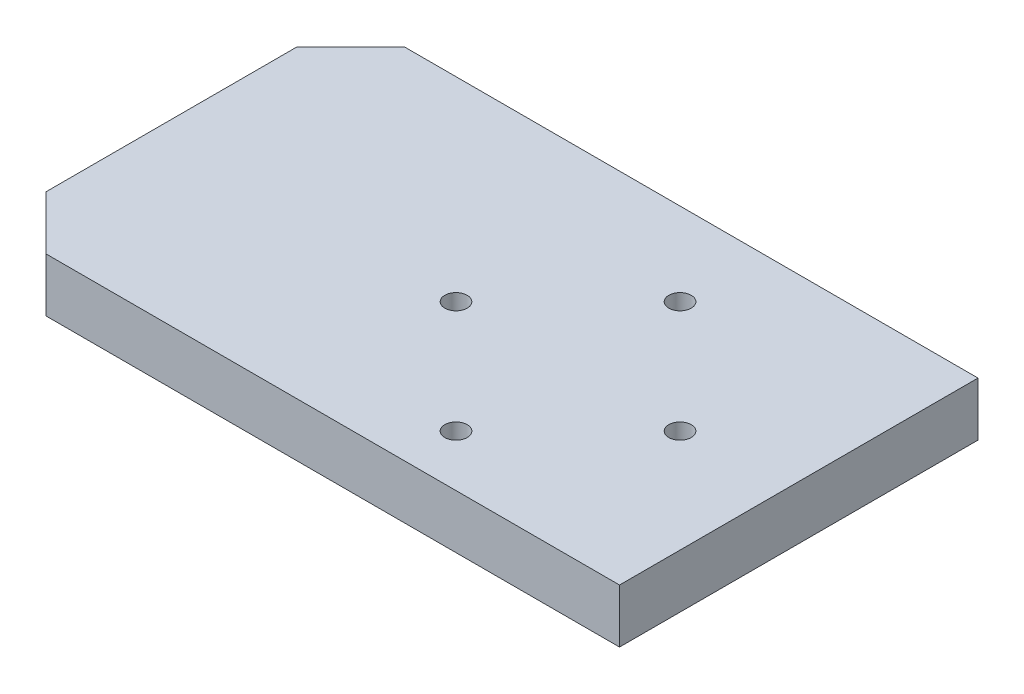
ISO-10303-21;
HEADER;
FILE_DESCRIPTION(('STEP AP214'),'2;1');
FILE_NAME('part.step','',(''),(''),'','','');
FILE_SCHEMA(('AUTOMOTIVE_DESIGN { 1 0 10303 214 1 1 1 1 }'));
ENDSEC;
DATA;
#1=APPLICATION_CONTEXT('core data for automotive mechanical design processes');
#2=APPLICATION_PROTOCOL_DEFINITION('international standard','automotive_design',2000,#1);
#3=PRODUCT_CONTEXT('',#1,'mechanical');
#4=PRODUCT('Part','Part','',(#3));
#5=PRODUCT_RELATED_PRODUCT_CATEGORY('part','',(#4));
#6=PRODUCT_DEFINITION_FORMATION('','',#4);
#7=PRODUCT_DEFINITION_CONTEXT('part definition',#1,'design');
#8=PRODUCT_DEFINITION('design','',#6,#7);
#9=PRODUCT_DEFINITION_SHAPE('','',#8);
#10=(LENGTH_UNIT() NAMED_UNIT(*) SI_UNIT(.MILLI.,.METRE.));
#11=(NAMED_UNIT(*) PLANE_ANGLE_UNIT() SI_UNIT($,.RADIAN.));
#12=(NAMED_UNIT(*) SI_UNIT($,.STERADIAN.) SOLID_ANGLE_UNIT());
#13=UNCERTAINTY_MEASURE_WITH_UNIT(LENGTH_MEASURE(1.E-05),#10,'distance_accuracy_value','');
#14=(GEOMETRIC_REPRESENTATION_CONTEXT(3) GLOBAL_UNCERTAINTY_ASSIGNED_CONTEXT((#13)) GLOBAL_UNIT_ASSIGNED_CONTEXT((#10,
#11,#12)) REPRESENTATION_CONTEXT('',''));
#15=CARTESIAN_POINT('',(0.,0.,0.));
#16=DIRECTION('',(0.,0.,1.));
#17=DIRECTION('',(1.,0.,0.));
#18=AXIS2_PLACEMENT_3D('',#15,#16,#17);
#19=CARTESIAN_POINT('',(0.,12.,0.));
#20=DIRECTION('',(0.,-1.,0.));
#21=DIRECTION('',(0.,0.,-1.));
#22=AXIS2_PLACEMENT_3D('',#19,#20,#21);
#23=PLANE('',#22);
#24=DIRECTION('',(0.,0.,-1.));
#25=VECTOR('',#24,1.);
#26=CARTESIAN_POINT('',(70.,12.,-40.));
#27=LINE('',#26,#25);
#28=CARTESIAN_POINT('',(70.,12.,40.));
#29=VERTEX_POINT('',#28);
#30=CARTESIAN_POINT('',(70.,12.,-40.));
#31=VERTEX_POINT('',#30);
#32=EDGE_CURVE('E129',#29,#31,#27,.T.);
#33=ORIENTED_EDGE('',*,*,#32,.T.);
#34=DIRECTION('',(-1.,0.,0.));
#35=VECTOR('',#34,1.);
#36=CARTESIAN_POINT('',(70.,12.,-40.));
#37=LINE('',#36,#35);
#38=CARTESIAN_POINT('',(-58.,12.,-39.9999999999999));
#39=VERTEX_POINT('',#38);
#40=EDGE_CURVE('E87',#31,#39,#37,.T.);
#41=ORIENTED_EDGE('',*,*,#40,.T.);
#42=DIRECTION('',(-0.70710678118655,0.,0.707106781186545));
#43=VECTOR('',#42,1.);
#44=CARTESIAN_POINT('',(-58.,12.,-39.9999999999999));
#45=LINE('',#44,#43);
#46=CARTESIAN_POINT('',(-70.,12.,-28.));
#47=VERTEX_POINT('',#46);
#48=EDGE_CURVE('E100',#39,#47,#45,.T.);
#49=ORIENTED_EDGE('',*,*,#48,.T.);
#50=DIRECTION('',(0.,0.,1.));
#51=VECTOR('',#50,1.);
#52=CARTESIAN_POINT('',(-70.,12.,-28.));
#53=LINE('',#52,#51);
#54=CARTESIAN_POINT('',(-70.,12.,28.));
#55=VERTEX_POINT('',#54);
#56=EDGE_CURVE('E94',#47,#55,#53,.T.);
#57=ORIENTED_EDGE('',*,*,#56,.T.);
#58=DIRECTION('',(0.707106781186547,0.,0.707106781186548));
#59=VECTOR('',#58,1.);
#60=CARTESIAN_POINT('',(-58.,12.,40.));
#61=LINE('',#60,#59);
#62=CARTESIAN_POINT('',(-58.,12.,40.));
#63=VERTEX_POINT('',#62);
#64=EDGE_CURVE('E98',#55,#63,#61,.T.);
#65=ORIENTED_EDGE('',*,*,#64,.T.);
#66=DIRECTION('',(1.,0.,0.));
#67=VECTOR('',#66,1.);
#68=CARTESIAN_POINT('',(70.,12.,40.));
#69=LINE('',#68,#67);
#70=EDGE_CURVE('E50',#63,#29,#69,.T.);
#71=ORIENTED_EDGE('',*,*,#70,.T.);
#72=EDGE_LOOP('',(#33,#41,#49,#57,#65,#71));
#73=FACE_BOUND('',#72,.T.);
#74=CARTESIAN_POINT('',(22.,12.,-21.5));
#75=DIRECTION('',(0.,1.,0.));
#76=DIRECTION('',(0.,0.,1.));
#77=AXIS2_PLACEMENT_3D('',#74,#75,#76);
#78=CIRCLE('',#77,2.5);
#79=CARTESIAN_POINT('',(22.,12.,-19.));
#80=VERTEX_POINT('',#79);
#81=EDGE_CURVE('E122',#80,#80,#78,.T.);
#82=ORIENTED_EDGE('',*,*,#81,.F.);
#83=EDGE_LOOP('',(#82));
#84=FACE_BOUND('',#83,.T.);
#85=CARTESIAN_POINT('',(47.0000000000008,12.,3.49999999999938));
#86=DIRECTION('',(0.,1.,0.));
#87=DIRECTION('',(0.,0.,1.));
#88=AXIS2_PLACEMENT_3D('',#85,#86,#87);
#89=CIRCLE('',#88,2.5);
#90=CARTESIAN_POINT('',(47.0000000000008,12.,5.99999999999937));
#91=VERTEX_POINT('',#90);
#92=EDGE_CURVE('E193',#91,#91,#89,.T.);
#93=ORIENTED_EDGE('',*,*,#92,.F.);
#94=EDGE_LOOP('',(#93));
#95=FACE_BOUND('',#94,.T.);
#96=CARTESIAN_POINT('',(22.0000000000013,12.,28.5));
#97=DIRECTION('',(0.,1.,0.));
#98=DIRECTION('',(0.,0.,1.));
#99=AXIS2_PLACEMENT_3D('',#96,#97,#98);
#100=CIRCLE('',#99,2.5);
#101=CARTESIAN_POINT('',(22.0000000000013,12.,31.));
#102=VERTEX_POINT('',#101);
#103=EDGE_CURVE('E187',#102,#102,#100,.T.);
#104=ORIENTED_EDGE('',*,*,#103,.F.);
#105=EDGE_LOOP('',(#104));
#106=FACE_BOUND('',#105,.T.);
#107=CARTESIAN_POINT('',(-2.99999999999927,12.,3.50000000000043));
#108=DIRECTION('',(0.,1.,0.));
#109=DIRECTION('',(0.,0.,1.));
#110=AXIS2_PLACEMENT_3D('',#107,#108,#109);
#111=CIRCLE('',#110,2.5);
#112=CARTESIAN_POINT('',(-2.99999999999927,12.,6.00000000000042));
#113=VERTEX_POINT('',#112);
#114=EDGE_CURVE('E178',#113,#113,#111,.T.);
#115=ORIENTED_EDGE('',*,*,#114,.F.);
#116=EDGE_LOOP('',(#115));
#117=FACE_BOUND('',#116,.T.);
#118=ADVANCED_FACE('F33',(#73,#84,#95,#106,#117),#23,.F.);
#119=CARTESIAN_POINT('',(0.,0.,0.));
#120=DIRECTION('',(0.,-1.,0.));
#121=DIRECTION('',(0.,0.,-1.));
#122=AXIS2_PLACEMENT_3D('',#119,#120,#121);
#123=PLANE('',#122);
#124=CARTESIAN_POINT('',(22.0000000000013,0.,28.5));
#125=DIRECTION('',(0.,1.,0.));
#126=DIRECTION('',(0.,0.,1.));
#127=AXIS2_PLACEMENT_3D('',#124,#125,#126);
#128=CIRCLE('',#127,2.5);
#129=CARTESIAN_POINT('',(22.0000000000013,0.,31.));
#130=VERTEX_POINT('',#129);
#131=EDGE_CURVE('E184',#130,#130,#128,.T.);
#132=ORIENTED_EDGE('',*,*,#131,.T.);
#133=EDGE_LOOP('',(#132));
#134=FACE_BOUND('',#133,.T.);
#135=CARTESIAN_POINT('',(22.,0.,-21.5));
#136=DIRECTION('',(0.,1.,0.));
#137=DIRECTION('',(0.,0.,1.));
#138=AXIS2_PLACEMENT_3D('',#135,#136,#137);
#139=CIRCLE('',#138,2.5);
#140=CARTESIAN_POINT('',(22.,0.,-19.));
#141=VERTEX_POINT('',#140);
#142=EDGE_CURVE('E196',#141,#141,#139,.T.);
#143=ORIENTED_EDGE('',*,*,#142,.T.);
#144=EDGE_LOOP('',(#143));
#145=FACE_BOUND('',#144,.T.);
#146=DIRECTION('',(0.,0.,-1.));
#147=VECTOR('',#146,1.);
#148=CARTESIAN_POINT('',(70.,0.,-40.));
#149=LINE('',#148,#147);
#150=CARTESIAN_POINT('',(70.,0.,40.));
#151=VERTEX_POINT('',#150);
#152=CARTESIAN_POINT('',(70.,0.,-40.));
#153=VERTEX_POINT('',#152);
#154=EDGE_CURVE('E118',#151,#153,#149,.T.);
#155=ORIENTED_EDGE('',*,*,#154,.F.);
#156=DIRECTION('',(1.,0.,0.));
#157=VECTOR('',#156,1.);
#158=CARTESIAN_POINT('',(70.,0.,40.));
#159=LINE('',#158,#157);
#160=CARTESIAN_POINT('',(-58.,0.,40.));
#161=VERTEX_POINT('',#160);
#162=EDGE_CURVE('E79',#161,#151,#159,.T.);
#163=ORIENTED_EDGE('',*,*,#162,.F.);
#164=DIRECTION('',(0.707106781186547,0.,0.707106781186548));
#165=VECTOR('',#164,1.);
#166=CARTESIAN_POINT('',(-58.,0.,40.));
#167=LINE('',#166,#165);
#168=CARTESIAN_POINT('',(-70.,0.,28.));
#169=VERTEX_POINT('',#168);
#170=EDGE_CURVE('E73',#169,#161,#167,.T.);
#171=ORIENTED_EDGE('',*,*,#170,.F.);
#172=DIRECTION('',(0.,0.,1.));
#173=VECTOR('',#172,1.);
#174=CARTESIAN_POINT('',(-70.,0.,-28.));
#175=LINE('',#174,#173);
#176=CARTESIAN_POINT('',(-70.,0.,-28.));
#177=VERTEX_POINT('',#176);
#178=EDGE_CURVE('E108',#177,#169,#175,.T.);
#179=ORIENTED_EDGE('',*,*,#178,.F.);
#180=DIRECTION('',(-0.70710678118655,0.,0.707106781186545));
#181=VECTOR('',#180,1.);
#182=CARTESIAN_POINT('',(-58.,0.,-39.9999999999999));
#183=LINE('',#182,#181);
#184=CARTESIAN_POINT('',(-58.,0.,-39.9999999999999));
#185=VERTEX_POINT('',#184);
#186=EDGE_CURVE('E124',#185,#177,#183,.T.);
#187=ORIENTED_EDGE('',*,*,#186,.F.);
#188=DIRECTION('',(-1.,0.,0.));
#189=VECTOR('',#188,1.);
#190=CARTESIAN_POINT('',(70.,0.,-40.));
#191=LINE('',#190,#189);
#192=EDGE_CURVE('E121',#153,#185,#191,.T.);
#193=ORIENTED_EDGE('',*,*,#192,.F.);
#194=EDGE_LOOP('',(#155,#163,#171,#179,#187,#193));
#195=FACE_BOUND('',#194,.T.);
#196=CARTESIAN_POINT('',(47.0000000000008,0.,3.49999999999938));
#197=DIRECTION('',(0.,1.,0.));
#198=DIRECTION('',(0.,0.,1.));
#199=AXIS2_PLACEMENT_3D('',#196,#197,#198);
#200=CIRCLE('',#199,2.5);
#201=CARTESIAN_POINT('',(47.0000000000008,0.,5.99999999999937));
#202=VERTEX_POINT('',#201);
#203=EDGE_CURVE('E190',#202,#202,#200,.T.);
#204=ORIENTED_EDGE('',*,*,#203,.T.);
#205=EDGE_LOOP('',(#204));
#206=FACE_BOUND('',#205,.T.);
#207=CARTESIAN_POINT('',(-2.99999999999927,0.,3.50000000000043));
#208=DIRECTION('',(0.,1.,0.));
#209=DIRECTION('',(0.,0.,1.));
#210=AXIS2_PLACEMENT_3D('',#207,#208,#209);
#211=CIRCLE('',#210,2.5);
#212=CARTESIAN_POINT('',(-2.99999999999927,0.,6.00000000000042));
#213=VERTEX_POINT('',#212);
#214=EDGE_CURVE('E181',#213,#213,#211,.T.);
#215=ORIENTED_EDGE('',*,*,#214,.T.);
#216=EDGE_LOOP('',(#215));
#217=FACE_BOUND('',#216,.T.);
#218=ADVANCED_FACE('F138',(#134,#145,#195,#206,#217),#123,.T.);
#219=CARTESIAN_POINT('',(70.,12.,-40.));
#220=DIRECTION('',(-1.,0.,0.));
#221=DIRECTION('',(0.,0.,1.));
#222=AXIS2_PLACEMENT_3D('',#219,#220,#221);
#223=PLANE('',#222);
#224=ORIENTED_EDGE('',*,*,#154,.T.);
#225=DIRECTION('',(0.,-1.,0.));
#226=VECTOR('',#225,1.);
#227=CARTESIAN_POINT('',(70.,12.,-40.));
#228=LINE('',#227,#226);
#229=EDGE_CURVE('E11',#31,#153,#228,.T.);
#230=ORIENTED_EDGE('',*,*,#229,.F.);
#231=ORIENTED_EDGE('',*,*,#32,.F.);
#232=DIRECTION('',(0.,-1.,0.));
#233=VECTOR('',#232,1.);
#234=CARTESIAN_POINT('',(70.,12.,40.));
#235=LINE('',#234,#233);
#236=EDGE_CURVE('E114',#29,#151,#235,.T.);
#237=ORIENTED_EDGE('',*,*,#236,.T.);
#238=EDGE_LOOP('',(#224,#230,#231,#237));
#239=FACE_BOUND('',#238,.T.);
#240=ADVANCED_FACE('F35',(#239),#223,.F.);
#241=CARTESIAN_POINT('',(70.,12.,-40.));
#242=DIRECTION('',(0.,0.,1.));
#243=DIRECTION('',(1.,0.,0.));
#244=AXIS2_PLACEMENT_3D('',#241,#242,#243);
#245=PLANE('',#244);
#246=ORIENTED_EDGE('',*,*,#192,.T.);
#247=DIRECTION('',(0.,-1.,0.));
#248=VECTOR('',#247,1.);
#249=CARTESIAN_POINT('',(-58.,12.,-39.9999999999999));
#250=LINE('',#249,#248);
#251=EDGE_CURVE('E42',#39,#185,#250,.T.);
#252=ORIENTED_EDGE('',*,*,#251,.F.);
#253=ORIENTED_EDGE('',*,*,#40,.F.);
#254=ORIENTED_EDGE('',*,*,#229,.T.);
#255=EDGE_LOOP('',(#246,#252,#253,#254));
#256=FACE_BOUND('',#255,.T.);
#257=ADVANCED_FACE('F256',(#256),#245,.F.);
#258=CARTESIAN_POINT('',(-58.,12.,-39.9999999999999));
#259=DIRECTION('',(0.707106781186545,0.,0.70710678118655));
#260=DIRECTION('',(0.70710678118655,0.,-0.707106781186545));
#261=AXIS2_PLACEMENT_3D('',#258,#259,#260);
#262=PLANE('',#261);
#263=ORIENTED_EDGE('',*,*,#186,.T.);
#264=DIRECTION('',(0.,-1.,0.));
#265=VECTOR('',#264,1.);
#266=CARTESIAN_POINT('',(-70.,12.,-28.));
#267=LINE('',#266,#265);
#268=EDGE_CURVE('E109',#47,#177,#267,.T.);
#269=ORIENTED_EDGE('',*,*,#268,.F.);
#270=ORIENTED_EDGE('',*,*,#48,.F.);
#271=ORIENTED_EDGE('',*,*,#251,.T.);
#272=EDGE_LOOP('',(#263,#269,#270,#271));
#273=FACE_BOUND('',#272,.T.);
#274=ADVANCED_FACE('F135',(#273),#262,.F.);
#275=CARTESIAN_POINT('',(-70.,12.,-28.));
#276=DIRECTION('',(1.,0.,0.));
#277=DIRECTION('',(0.,0.,-1.));
#278=AXIS2_PLACEMENT_3D('',#275,#276,#277);
#279=PLANE('',#278);
#280=ORIENTED_EDGE('',*,*,#178,.T.);
#281=DIRECTION('',(0.,-1.,0.));
#282=VECTOR('',#281,1.);
#283=CARTESIAN_POINT('',(-70.,12.,28.));
#284=LINE('',#283,#282);
#285=EDGE_CURVE('E105',#55,#169,#284,.T.);
#286=ORIENTED_EDGE('',*,*,#285,.F.);
#287=ORIENTED_EDGE('',*,*,#56,.F.);
#288=ORIENTED_EDGE('',*,*,#268,.T.);
#289=EDGE_LOOP('',(#280,#286,#287,#288));
#290=FACE_BOUND('',#289,.T.);
#291=ADVANCED_FACE('F106',(#290),#279,.F.);
#292=CARTESIAN_POINT('',(-58.,12.,40.));
#293=DIRECTION('',(0.707106781186548,0.,-0.707106781186547));
#294=DIRECTION('',(-0.707106781186547,0.,-0.707106781186548));
#295=AXIS2_PLACEMENT_3D('',#292,#293,#294);
#296=PLANE('',#295);
#297=ORIENTED_EDGE('',*,*,#170,.T.);
#298=DIRECTION('',(0.,-1.,0.));
#299=VECTOR('',#298,1.);
#300=CARTESIAN_POINT('',(-58.,12.,40.));
#301=LINE('',#300,#299);
#302=EDGE_CURVE('E110',#63,#161,#301,.T.);
#303=ORIENTED_EDGE('',*,*,#302,.F.);
#304=ORIENTED_EDGE('',*,*,#64,.F.);
#305=ORIENTED_EDGE('',*,*,#285,.T.);
#306=EDGE_LOOP('',(#297,#303,#304,#305));
#307=FACE_BOUND('',#306,.T.);
#308=ADVANCED_FACE('F112',(#307),#296,.F.);
#309=CARTESIAN_POINT('',(70.,12.,40.));
#310=DIRECTION('',(0.,0.,-1.));
#311=DIRECTION('',(-1.,0.,0.));
#312=AXIS2_PLACEMENT_3D('',#309,#310,#311);
#313=PLANE('',#312);
#314=ORIENTED_EDGE('',*,*,#162,.T.);
#315=ORIENTED_EDGE('',*,*,#236,.F.);
#316=ORIENTED_EDGE('',*,*,#70,.F.);
#317=ORIENTED_EDGE('',*,*,#302,.T.);
#318=EDGE_LOOP('',(#314,#315,#316,#317));
#319=FACE_BOUND('',#318,.T.);
#320=ADVANCED_FACE('F143',(#319),#313,.F.);
#321=CARTESIAN_POINT('',(22.,12.,-21.5));
#322=DIRECTION('',(0.,-1.,0.));
#323=DIRECTION('',(0.,0.,-1.));
#324=AXIS2_PLACEMENT_3D('',#321,#322,#323);
#325=CYLINDRICAL_SURFACE('',#324,2.5);
#326=ORIENTED_EDGE('',*,*,#81,.T.);
#327=EDGE_LOOP('',(#326));
#328=FACE_BOUND('',#327,.T.);
#329=ORIENTED_EDGE('',*,*,#142,.F.);
#330=EDGE_LOOP('',(#329));
#331=FACE_BOUND('',#330,.T.);
#332=ADVANCED_FACE('F145',(#328,#331),#325,.F.);
#333=CARTESIAN_POINT('',(47.0000000000008,12.,3.49999999999938));
#334=DIRECTION('',(0.,-1.,0.));
#335=DIRECTION('',(0.,0.,-1.));
#336=AXIS2_PLACEMENT_3D('',#333,#334,#335);
#337=CYLINDRICAL_SURFACE('',#336,2.5);
#338=ORIENTED_EDGE('',*,*,#92,.T.);
#339=EDGE_LOOP('',(#338));
#340=FACE_BOUND('',#339,.T.);
#341=ORIENTED_EDGE('',*,*,#203,.F.);
#342=EDGE_LOOP('',(#341));
#343=FACE_BOUND('',#342,.T.);
#344=ADVANCED_FACE('F151',(#340,#343),#337,.F.);
#345=CARTESIAN_POINT('',(22.0000000000013,12.,28.5));
#346=DIRECTION('',(0.,-1.,0.));
#347=DIRECTION('',(0.,0.,-1.));
#348=AXIS2_PLACEMENT_3D('',#345,#346,#347);
#349=CYLINDRICAL_SURFACE('',#348,2.5);
#350=ORIENTED_EDGE('',*,*,#103,.T.);
#351=EDGE_LOOP('',(#350));
#352=FACE_BOUND('',#351,.T.);
#353=ORIENTED_EDGE('',*,*,#131,.F.);
#354=EDGE_LOOP('',(#353));
#355=FACE_BOUND('',#354,.T.);
#356=ADVANCED_FACE('F165',(#352,#355),#349,.F.);
#357=CARTESIAN_POINT('',(-2.99999999999927,12.,3.50000000000043));
#358=DIRECTION('',(0.,-1.,0.));
#359=DIRECTION('',(0.,0.,-1.));
#360=AXIS2_PLACEMENT_3D('',#357,#358,#359);
#361=CYLINDRICAL_SURFACE('',#360,2.5);
#362=ORIENTED_EDGE('',*,*,#114,.T.);
#363=EDGE_LOOP('',(#362));
#364=FACE_BOUND('',#363,.T.);
#365=ORIENTED_EDGE('',*,*,#214,.F.);
#366=EDGE_LOOP('',(#365));
#367=FACE_BOUND('',#366,.T.);
#368=ADVANCED_FACE('F169',(#364,#367),#361,.F.);
#369=CLOSED_SHELL('',(#118,#218,#240,#257,#274,#291,#308,#320,#332,#344,#356,#368));
#370=MANIFOLD_SOLID_BREP('B2',#369);
#371=ADVANCED_BREP_SHAPE_REPRESENTATION('',(#18,#370),#14);
#372=SHAPE_DEFINITION_REPRESENTATION(#9,#371);
ENDSEC;
END-ISO-10303-21;
